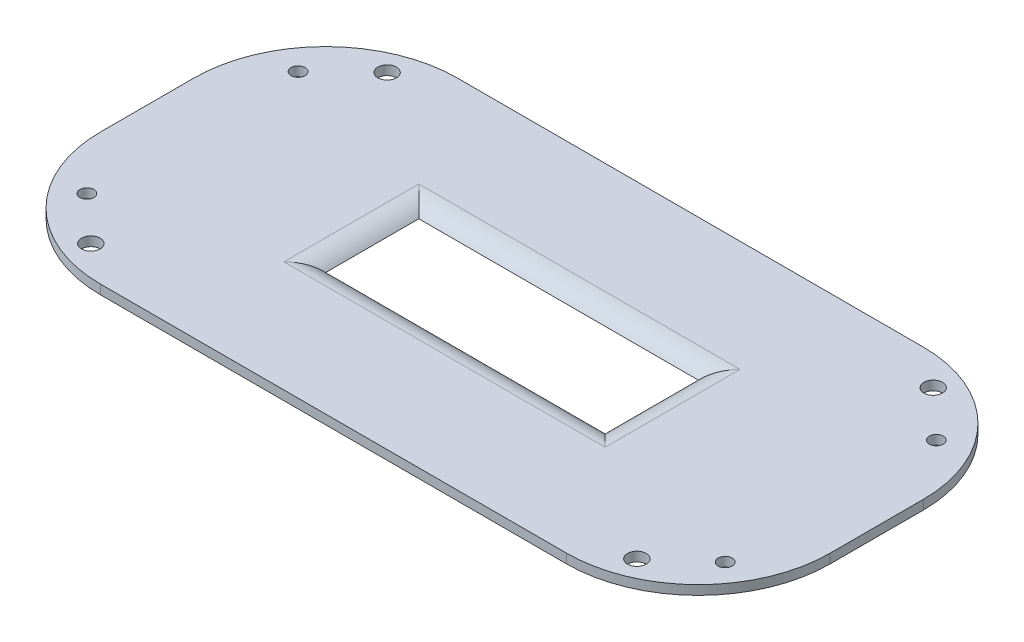
ISO-10303-21;
HEADER;
FILE_DESCRIPTION(('STEP AP214'),'2;1');
FILE_NAME('part.step','',(''),(''),'','','');
FILE_SCHEMA(('AUTOMOTIVE_DESIGN { 1 0 10303 214 1 1 1 1 }'));
ENDSEC;
DATA;
#1=APPLICATION_CONTEXT('core data for automotive mechanical design processes');
#2=APPLICATION_PROTOCOL_DEFINITION('international standard','automotive_design',2000,#1);
#3=PRODUCT_CONTEXT('',#1,'mechanical');
#4=PRODUCT('Part','Part','',(#3));
#5=PRODUCT_RELATED_PRODUCT_CATEGORY('part','',(#4));
#6=PRODUCT_DEFINITION_FORMATION('','',#4);
#7=PRODUCT_DEFINITION_CONTEXT('part definition',#1,'design');
#8=PRODUCT_DEFINITION('design','',#6,#7);
#9=PRODUCT_DEFINITION_SHAPE('','',#8);
#10=(LENGTH_UNIT() NAMED_UNIT(*) SI_UNIT(.MILLI.,.METRE.));
#11=(NAMED_UNIT(*) PLANE_ANGLE_UNIT() SI_UNIT($,.RADIAN.));
#12=(NAMED_UNIT(*) SI_UNIT($,.STERADIAN.) SOLID_ANGLE_UNIT());
#13=UNCERTAINTY_MEASURE_WITH_UNIT(LENGTH_MEASURE(1.E-05),#10,'distance_accuracy_value','');
#14=(GEOMETRIC_REPRESENTATION_CONTEXT(3) GLOBAL_UNCERTAINTY_ASSIGNED_CONTEXT((#13)) GLOBAL_UNIT_ASSIGNED_CONTEXT((#10,
#11,#12)) REPRESENTATION_CONTEXT('',''));
#15=CARTESIAN_POINT('',(0.,0.,0.));
#16=DIRECTION('',(0.,0.,1.));
#17=DIRECTION('',(1.,0.,0.));
#18=AXIS2_PLACEMENT_3D('',#15,#16,#17);
#19=CARTESIAN_POINT('',(0.,-33.,0.));
#20=DIRECTION('',(0.,-1.,0.));
#21=DIRECTION('',(0.,0.,-1.));
#22=AXIS2_PLACEMENT_3D('',#19,#20,#21);
#23=PLANE('',#22);
#24=DIRECTION('',(0.,0.,1.));
#25=VECTOR('',#24,1.);
#26=CARTESIAN_POINT('',(-34.4721359549996,-33.,0.));
#27=LINE('',#26,#25);
#28=CARTESIAN_POINT('',(-34.4721359549996,-33.,14.4721359549996));
#29=VERTEX_POINT('',#28);
#30=CARTESIAN_POINT('',(-34.4721359549996,-33.,-14.4721359549996));
#31=VERTEX_POINT('',#30);
#32=EDGE_CURVE('E65',#29,#31,#27,.F.);
#33=ORIENTED_EDGE('',*,*,#32,.T.);
#34=DIRECTION('',(-1.,0.,0.));
#35=VECTOR('',#34,1.);
#36=CARTESIAN_POINT('',(0.,-33.,-14.4721359549996));
#37=LINE('',#36,#35);
#38=CARTESIAN_POINT('',(34.4721359549996,-33.,-14.4721359549996));
#39=VERTEX_POINT('',#38);
#40=EDGE_CURVE('E11',#31,#39,#37,.F.);
#41=ORIENTED_EDGE('',*,*,#40,.T.);
#42=DIRECTION('',(0.,0.,-1.));
#43=VECTOR('',#42,1.);
#44=CARTESIAN_POINT('',(34.4721359549996,-33.,0.));
#45=LINE('',#44,#43);
#46=CARTESIAN_POINT('',(34.4721359549996,-33.,14.4721359549996));
#47=VERTEX_POINT('',#46);
#48=EDGE_CURVE('E205',#39,#47,#45,.F.);
#49=ORIENTED_EDGE('',*,*,#48,.T.);
#50=DIRECTION('',(1.,0.,0.));
#51=VECTOR('',#50,1.);
#52=CARTESIAN_POINT('',(0.,-33.,14.4721359549996));
#53=LINE('',#52,#51);
#54=EDGE_CURVE('E76',#47,#29,#53,.F.);
#55=ORIENTED_EDGE('',*,*,#54,.T.);
#56=EDGE_LOOP('',(#33,#41,#49,#55));
#57=FACE_BOUND('',#56,.T.);
#58=CARTESIAN_POINT('',(-68.3210170546388,-33.,22.9274377046451));
#59=DIRECTION('',(0.,1.,0.));
#60=DIRECTION('',(0.,0.,-1.));
#61=AXIS2_PLACEMENT_3D('',#58,#59,#60);
#62=CIRCLE('',#61,1.5);
#63=CARTESIAN_POINT('',(-68.3210170546388,-33.,21.4274377046451));
#64=VERTEX_POINT('',#63);
#65=EDGE_CURVE('E244',#64,#64,#62,.T.);
#66=ORIENTED_EDGE('',*,*,#65,.F.);
#67=EDGE_LOOP('',(#66));
#68=FACE_BOUND('',#67,.T.);
#69=CARTESIAN_POINT('',(68.6789829453612,-33.,22.9274377046451));
#70=DIRECTION('',(0.,1.,0.));
#71=DIRECTION('',(0.,0.,1.));
#72=AXIS2_PLACEMENT_3D('',#69,#70,#71);
#73=CIRCLE('',#72,1.5);
#74=CARTESIAN_POINT('',(68.6789829453612,-33.,24.4274377046451));
#75=VERTEX_POINT('',#74);
#76=EDGE_CURVE('E247',#75,#75,#73,.T.);
#77=ORIENTED_EDGE('',*,*,#76,.F.);
#78=EDGE_LOOP('',(#77));
#79=FACE_BOUND('',#78,.T.);
#80=CARTESIAN_POINT('',(68.6789829453612,-33.,-22.3904888685615));
#81=DIRECTION('',(0.,1.,0.));
#82=DIRECTION('',(0.,0.,-1.));
#83=AXIS2_PLACEMENT_3D('',#80,#81,#82);
#84=CIRCLE('',#83,1.5);
#85=CARTESIAN_POINT('',(68.6789829453612,-33.,-23.8904888685615));
#86=VERTEX_POINT('',#85);
#87=EDGE_CURVE('E253',#86,#86,#84,.T.);
#88=ORIENTED_EDGE('',*,*,#87,.F.);
#89=EDGE_LOOP('',(#88));
#90=FACE_BOUND('',#89,.T.);
#91=CARTESIAN_POINT('',(-68.3210170546388,-33.,-22.3904888685615));
#92=DIRECTION('',(0.,1.,0.));
#93=DIRECTION('',(0.,0.,1.));
#94=AXIS2_PLACEMENT_3D('',#91,#92,#93);
#95=CIRCLE('',#94,1.5);
#96=CARTESIAN_POINT('',(-68.3210170546388,-33.,-20.8904888685615));
#97=VERTEX_POINT('',#96);
#98=EDGE_CURVE('E257',#97,#97,#95,.T.);
#99=ORIENTED_EDGE('',*,*,#98,.F.);
#100=EDGE_LOOP('',(#99));
#101=FACE_BOUND('',#100,.T.);
#102=CARTESIAN_POINT('',(-58.6,-33.,-31.8));
#103=DIRECTION('',(0.,-1.,0.));
#104=DIRECTION('',(1.,0.,0.));
#105=AXIS2_PLACEMENT_3D('',#102,#103,#104);
#106=CIRCLE('',#105,2.);
#107=CARTESIAN_POINT('',(-60.6,-33.,-31.8));
#108=VERTEX_POINT('',#107);
#109=EDGE_CURVE('E305',#108,#108,#106,.T.);
#110=ORIENTED_EDGE('',*,*,#109,.T.);
#111=EDGE_LOOP('',(#110));
#112=FACE_BOUND('',#111,.T.);
#113=CARTESIAN_POINT('',(-58.6,-33.,31.8));
#114=DIRECTION('',(0.,-1.,0.));
#115=DIRECTION('',(1.,0.,0.));
#116=AXIS2_PLACEMENT_3D('',#113,#114,#115);
#117=CIRCLE('',#116,2.);
#118=CARTESIAN_POINT('',(-60.6,-33.,31.8));
#119=VERTEX_POINT('',#118);
#120=EDGE_CURVE('E267',#119,#119,#117,.T.);
#121=ORIENTED_EDGE('',*,*,#120,.T.);
#122=EDGE_LOOP('',(#121));
#123=FACE_BOUND('',#122,.T.);
#124=CARTESIAN_POINT('',(58.6,-33.,-31.8));
#125=DIRECTION('',(0.,-1.,0.));
#126=DIRECTION('',(1.,0.,0.));
#127=AXIS2_PLACEMENT_3D('',#124,#125,#126);
#128=CIRCLE('',#127,2.);
#129=CARTESIAN_POINT('',(56.6,-33.,-31.8));
#130=VERTEX_POINT('',#129);
#131=EDGE_CURVE('E298',#130,#130,#128,.T.);
#132=ORIENTED_EDGE('',*,*,#131,.T.);
#133=EDGE_LOOP('',(#132));
#134=FACE_BOUND('',#133,.T.);
#135=CARTESIAN_POINT('',(58.6,-33.,31.8));
#136=DIRECTION('',(0.,-1.,0.));
#137=DIRECTION('',(1.,0.,0.));
#138=AXIS2_PLACEMENT_3D('',#135,#136,#137);
#139=CIRCLE('',#138,2.);
#140=CARTESIAN_POINT('',(56.6,-33.,31.8));
#141=VERTEX_POINT('',#140);
#142=EDGE_CURVE('E262',#141,#141,#139,.T.);
#143=ORIENTED_EDGE('',*,*,#142,.T.);
#144=EDGE_LOOP('',(#143));
#145=FACE_BOUND('',#144,.T.);
#146=CARTESIAN_POINT('',(50.,-33.,10.));
#147=DIRECTION('',(0.,1.,0.));
#148=DIRECTION('',(1.,0.,0.));
#149=AXIS2_PLACEMENT_3D('',#146,#147,#148);
#150=CIRCLE('',#149,28.3);
#151=CARTESIAN_POINT('',(50.,-33.,38.3));
#152=VERTEX_POINT('',#151);
#153=CARTESIAN_POINT('',(78.3,-33.,10.));
#154=VERTEX_POINT('',#153);
#155=EDGE_CURVE('E220',#152,#154,#150,.T.);
#156=ORIENTED_EDGE('',*,*,#155,.T.);
#157=DIRECTION('',(0.,0.,-1.));
#158=VECTOR('',#157,1.);
#159=CARTESIAN_POINT('',(78.3,-33.,10.));
#160=LINE('',#159,#158);
#161=CARTESIAN_POINT('',(78.3,-33.,-10.));
#162=VERTEX_POINT('',#161);
#163=EDGE_CURVE('E378',#154,#162,#160,.T.);
#164=ORIENTED_EDGE('',*,*,#163,.T.);
#165=CARTESIAN_POINT('',(50.,-33.,-10.));
#166=DIRECTION('',(0.,1.,0.));
#167=DIRECTION('',(0.,0.,-1.));
#168=AXIS2_PLACEMENT_3D('',#165,#166,#167);
#169=CIRCLE('',#168,28.3);
#170=CARTESIAN_POINT('',(50.,-33.,-38.3));
#171=VERTEX_POINT('',#170);
#172=EDGE_CURVE('E368',#162,#171,#169,.T.);
#173=ORIENTED_EDGE('',*,*,#172,.T.);
#174=DIRECTION('',(-1.,0.,0.));
#175=VECTOR('',#174,1.);
#176=CARTESIAN_POINT('',(50.,-33.,-38.3));
#177=LINE('',#176,#175);
#178=CARTESIAN_POINT('',(-50.,-33.,-38.3));
#179=VERTEX_POINT('',#178);
#180=EDGE_CURVE('E357',#171,#179,#177,.T.);
#181=ORIENTED_EDGE('',*,*,#180,.T.);
#182=CARTESIAN_POINT('',(-50.,-33.,-10.));
#183=DIRECTION('',(0.,1.,0.));
#184=DIRECTION('',(-1.,0.,0.));
#185=AXIS2_PLACEMENT_3D('',#182,#183,#184);
#186=CIRCLE('',#185,28.3);
#187=CARTESIAN_POINT('',(-78.3,-33.,-10.));
#188=VERTEX_POINT('',#187);
#189=EDGE_CURVE('E291',#179,#188,#186,.T.);
#190=ORIENTED_EDGE('',*,*,#189,.T.);
#191=DIRECTION('',(0.,0.,1.));
#192=VECTOR('',#191,1.);
#193=CARTESIAN_POINT('',(-78.3,-33.,-10.));
#194=LINE('',#193,#192);
#195=CARTESIAN_POINT('',(-78.3,-33.,10.));
#196=VERTEX_POINT('',#195);
#197=EDGE_CURVE('E319',#188,#196,#194,.T.);
#198=ORIENTED_EDGE('',*,*,#197,.T.);
#199=CARTESIAN_POINT('',(-50.,-33.,10.));
#200=DIRECTION('',(0.,1.,0.));
#201=DIRECTION('',(0.,0.,1.));
#202=AXIS2_PLACEMENT_3D('',#199,#200,#201);
#203=CIRCLE('',#202,28.3);
#204=CARTESIAN_POINT('',(-50.,-33.,38.3));
#205=VERTEX_POINT('',#204);
#206=EDGE_CURVE('E336',#196,#205,#203,.T.);
#207=ORIENTED_EDGE('',*,*,#206,.T.);
#208=DIRECTION('',(1.,0.,0.));
#209=VECTOR('',#208,1.);
#210=CARTESIAN_POINT('',(-50.,-33.,38.3));
#211=LINE('',#210,#209);
#212=EDGE_CURVE('E285',#205,#152,#211,.T.);
#213=ORIENTED_EDGE('',*,*,#212,.T.);
#214=EDGE_LOOP('',(#156,#164,#173,#181,#190,#198,#207,#213));
#215=FACE_BOUND('',#214,.T.);
#216=ADVANCED_FACE('F55',(#57,#68,#79,#90,#101,#112,#123,#134,#145,#215),#23,.F.);
#217=CARTESIAN_POINT('',(0.,-35.,0.));
#218=DIRECTION('',(0.,-1.,0.));
#219=DIRECTION('',(0.,0.,-1.));
#220=AXIS2_PLACEMENT_3D('',#217,#218,#219);
#221=PLANE('',#220);
#222=DIRECTION('',(0.,0.,1.));
#223=VECTOR('',#222,1.);
#224=CARTESIAN_POINT('',(30.,-35.,0.));
#225=LINE('',#224,#223);
#226=CARTESIAN_POINT('',(30.,-35.,-10.));
#227=VERTEX_POINT('',#226);
#228=CARTESIAN_POINT('',(30.,-35.,10.));
#229=VERTEX_POINT('',#228);
#230=EDGE_CURVE('E193',#227,#229,#225,.T.);
#231=ORIENTED_EDGE('',*,*,#230,.F.);
#232=DIRECTION('',(1.,0.,0.));
#233=VECTOR('',#232,1.);
#234=CARTESIAN_POINT('',(0.,-35.,-10.));
#235=LINE('',#234,#233);
#236=CARTESIAN_POINT('',(-30.,-35.,-10.));
#237=VERTEX_POINT('',#236);
#238=EDGE_CURVE('E198',#237,#227,#235,.T.);
#239=ORIENTED_EDGE('',*,*,#238,.F.);
#240=DIRECTION('',(0.,0.,-1.));
#241=VECTOR('',#240,1.);
#242=CARTESIAN_POINT('',(-30.,-35.,0.));
#243=LINE('',#242,#241);
#244=CARTESIAN_POINT('',(-30.,-35.,10.));
#245=VERTEX_POINT('',#244);
#246=EDGE_CURVE('E219',#245,#237,#243,.T.);
#247=ORIENTED_EDGE('',*,*,#246,.F.);
#248=DIRECTION('',(-1.,0.,0.));
#249=VECTOR('',#248,1.);
#250=CARTESIAN_POINT('',(0.,-35.,10.));
#251=LINE('',#250,#249);
#252=EDGE_CURVE('E200',#229,#245,#251,.T.);
#253=ORIENTED_EDGE('',*,*,#252,.F.);
#254=EDGE_LOOP('',(#231,#239,#247,#253));
#255=FACE_BOUND('',#254,.T.);
#256=CARTESIAN_POINT('',(-68.3210170546388,-35.,22.9274377046451));
#257=DIRECTION('',(0.,-1.,0.));
#258=DIRECTION('',(0.,0.,-1.));
#259=AXIS2_PLACEMENT_3D('',#256,#257,#258);
#260=CIRCLE('',#259,1.5);
#261=CARTESIAN_POINT('',(-68.3210170546388,-35.,21.4274377046451));
#262=VERTEX_POINT('',#261);
#263=EDGE_CURVE('E228',#262,#262,#260,.T.);
#264=ORIENTED_EDGE('',*,*,#263,.F.);
#265=EDGE_LOOP('',(#264));
#266=FACE_BOUND('',#265,.T.);
#267=CARTESIAN_POINT('',(68.6789829453612,-35.,22.9274377046451));
#268=DIRECTION('',(0.,-1.,0.));
#269=DIRECTION('',(0.,0.,-1.));
#270=AXIS2_PLACEMENT_3D('',#267,#268,#269);
#271=CIRCLE('',#270,1.5);
#272=CARTESIAN_POINT('',(68.6789829453612,-35.,21.4274377046451));
#273=VERTEX_POINT('',#272);
#274=EDGE_CURVE('E393',#273,#273,#271,.T.);
#275=ORIENTED_EDGE('',*,*,#274,.F.);
#276=EDGE_LOOP('',(#275));
#277=FACE_BOUND('',#276,.T.);
#278=CARTESIAN_POINT('',(68.6789829453612,-35.,-22.3904888685615));
#279=DIRECTION('',(0.,-1.,0.));
#280=DIRECTION('',(0.,0.,-1.));
#281=AXIS2_PLACEMENT_3D('',#278,#279,#280);
#282=CIRCLE('',#281,1.5);
#283=CARTESIAN_POINT('',(68.6789829453612,-35.,-23.8904888685615));
#284=VERTEX_POINT('',#283);
#285=EDGE_CURVE('E390',#284,#284,#282,.T.);
#286=ORIENTED_EDGE('',*,*,#285,.F.);
#287=EDGE_LOOP('',(#286));
#288=FACE_BOUND('',#287,.T.);
#289=CARTESIAN_POINT('',(-68.3210170546388,-35.,-22.3904888685615));
#290=DIRECTION('',(0.,-1.,0.));
#291=DIRECTION('',(0.,0.,-1.));
#292=AXIS2_PLACEMENT_3D('',#289,#290,#291);
#293=CIRCLE('',#292,1.5);
#294=CARTESIAN_POINT('',(-68.3210170546388,-35.,-23.8904888685615));
#295=VERTEX_POINT('',#294);
#296=EDGE_CURVE('E261',#295,#295,#293,.T.);
#297=ORIENTED_EDGE('',*,*,#296,.F.);
#298=EDGE_LOOP('',(#297));
#299=FACE_BOUND('',#298,.T.);
#300=CARTESIAN_POINT('',(-58.6,-35.,-31.8));
#301=DIRECTION('',(0.,1.,0.));
#302=DIRECTION('',(1.,0.,0.));
#303=AXIS2_PLACEMENT_3D('',#300,#301,#302);
#304=CIRCLE('',#303,2.);
#305=CARTESIAN_POINT('',(-60.6,-35.,-31.8));
#306=VERTEX_POINT('',#305);
#307=EDGE_CURVE('E327',#306,#306,#304,.T.);
#308=ORIENTED_EDGE('',*,*,#307,.T.);
#309=EDGE_LOOP('',(#308));
#310=FACE_BOUND('',#309,.T.);
#311=CARTESIAN_POINT('',(-58.6,-35.,31.8));
#312=DIRECTION('',(0.,1.,0.));
#313=DIRECTION('',(1.,0.,0.));
#314=AXIS2_PLACEMENT_3D('',#311,#312,#313);
#315=CIRCLE('',#314,2.);
#316=CARTESIAN_POINT('',(-60.6,-35.,31.8));
#317=VERTEX_POINT('',#316);
#318=EDGE_CURVE('E310',#317,#317,#315,.T.);
#319=ORIENTED_EDGE('',*,*,#318,.T.);
#320=EDGE_LOOP('',(#319));
#321=FACE_BOUND('',#320,.T.);
#322=CARTESIAN_POINT('',(58.6,-35.,-31.8));
#323=DIRECTION('',(0.,1.,0.));
#324=DIRECTION('',(1.,0.,0.));
#325=AXIS2_PLACEMENT_3D('',#322,#323,#324);
#326=CIRCLE('',#325,2.);
#327=CARTESIAN_POINT('',(56.6,-35.,-31.8));
#328=VERTEX_POINT('',#327);
#329=EDGE_CURVE('E272',#328,#328,#326,.T.);
#330=ORIENTED_EDGE('',*,*,#329,.T.);
#331=EDGE_LOOP('',(#330));
#332=FACE_BOUND('',#331,.T.);
#333=CARTESIAN_POINT('',(58.6,-35.,31.8));
#334=DIRECTION('',(0.,1.,0.));
#335=DIRECTION('',(1.,0.,0.));
#336=AXIS2_PLACEMENT_3D('',#333,#334,#335);
#337=CIRCLE('',#336,2.);
#338=CARTESIAN_POINT('',(56.6,-35.,31.8));
#339=VERTEX_POINT('',#338);
#340=EDGE_CURVE('E276',#339,#339,#337,.T.);
#341=ORIENTED_EDGE('',*,*,#340,.T.);
#342=EDGE_LOOP('',(#341));
#343=FACE_BOUND('',#342,.T.);
#344=CARTESIAN_POINT('',(50.,-35.,10.));
#345=DIRECTION('',(0.,-1.,0.));
#346=DIRECTION('',(1.,0.,0.));
#347=AXIS2_PLACEMENT_3D('',#344,#345,#346);
#348=CIRCLE('',#347,28.3);
#349=CARTESIAN_POINT('',(78.3,-35.,10.));
#350=VERTEX_POINT('',#349);
#351=CARTESIAN_POINT('',(50.,-35.,38.3));
#352=VERTEX_POINT('',#351);
#353=EDGE_CURVE('E225',#350,#352,#348,.T.);
#354=ORIENTED_EDGE('',*,*,#353,.T.);
#355=DIRECTION('',(1.,0.,0.));
#356=VECTOR('',#355,1.);
#357=CARTESIAN_POINT('',(-50.,-35.,38.3));
#358=LINE('',#357,#356);
#359=CARTESIAN_POINT('',(-50.,-35.,38.3));
#360=VERTEX_POINT('',#359);
#361=EDGE_CURVE('E290',#360,#352,#358,.T.);
#362=ORIENTED_EDGE('',*,*,#361,.F.);
#363=CARTESIAN_POINT('',(-50.,-35.,10.));
#364=DIRECTION('',(0.,-1.,0.));
#365=DIRECTION('',(0.,0.,1.));
#366=AXIS2_PLACEMENT_3D('',#363,#364,#365);
#367=CIRCLE('',#366,28.3);
#368=CARTESIAN_POINT('',(-78.3,-35.,10.));
#369=VERTEX_POINT('',#368);
#370=EDGE_CURVE('E284',#360,#369,#367,.T.);
#371=ORIENTED_EDGE('',*,*,#370,.T.);
#372=DIRECTION('',(0.,0.,1.));
#373=VECTOR('',#372,1.);
#374=CARTESIAN_POINT('',(-78.3,-35.,-10.));
#375=LINE('',#374,#373);
#376=CARTESIAN_POINT('',(-78.3,-35.,-10.));
#377=VERTEX_POINT('',#376);
#378=EDGE_CURVE('E316',#377,#369,#375,.T.);
#379=ORIENTED_EDGE('',*,*,#378,.F.);
#380=CARTESIAN_POINT('',(-50.,-35.,-10.));
#381=DIRECTION('',(0.,-1.,0.));
#382=DIRECTION('',(-1.,0.,0.));
#383=AXIS2_PLACEMENT_3D('',#380,#381,#382);
#384=CIRCLE('',#383,28.3);
#385=CARTESIAN_POINT('',(-50.,-35.,-38.3));
#386=VERTEX_POINT('',#385);
#387=EDGE_CURVE('E295',#377,#386,#384,.T.);
#388=ORIENTED_EDGE('',*,*,#387,.T.);
#389=DIRECTION('',(-1.,0.,0.));
#390=VECTOR('',#389,1.);
#391=CARTESIAN_POINT('',(50.,-35.,-38.3));
#392=LINE('',#391,#390);
#393=CARTESIAN_POINT('',(50.,-35.,-38.3));
#394=VERTEX_POINT('',#393);
#395=EDGE_CURVE('E354',#394,#386,#392,.T.);
#396=ORIENTED_EDGE('',*,*,#395,.F.);
#397=CARTESIAN_POINT('',(50.,-35.,-10.));
#398=DIRECTION('',(0.,-1.,0.));
#399=DIRECTION('',(0.,0.,-1.));
#400=AXIS2_PLACEMENT_3D('',#397,#398,#399);
#401=CIRCLE('',#400,28.3);
#402=CARTESIAN_POINT('',(78.3,-35.,-10.));
#403=VERTEX_POINT('',#402);
#404=EDGE_CURVE('E364',#394,#403,#401,.T.);
#405=ORIENTED_EDGE('',*,*,#404,.T.);
#406=DIRECTION('',(0.,0.,-1.));
#407=VECTOR('',#406,1.);
#408=CARTESIAN_POINT('',(78.3,-35.,10.));
#409=LINE('',#408,#407);
#410=EDGE_CURVE('E375',#350,#403,#409,.T.);
#411=ORIENTED_EDGE('',*,*,#410,.F.);
#412=EDGE_LOOP('',(#354,#362,#371,#379,#388,#396,#405,#411));
#413=FACE_BOUND('',#412,.T.);
#414=ADVANCED_FACE('F195',(#255,#266,#277,#288,#299,#310,#321,#332,#343,#413),#221,.T.);
#415=CARTESIAN_POINT('',(50.,-35.,10.));
#416=DIRECTION('',(0.,1.,0.));
#417=DIRECTION('',(1.,0.,0.));
#418=AXIS2_PLACEMENT_3D('',#415,#416,#417);
#419=CYLINDRICAL_SURFACE('',#418,28.3);
#420=ORIENTED_EDGE('',*,*,#353,.F.);
#421=DIRECTION('',(0.,1.,0.));
#422=VECTOR('',#421,1.);
#423=CARTESIAN_POINT('',(78.3,-35.,10.));
#424=LINE('',#423,#422);
#425=EDGE_CURVE('E381',#350,#154,#424,.T.);
#426=ORIENTED_EDGE('',*,*,#425,.T.);
#427=ORIENTED_EDGE('',*,*,#155,.F.);
#428=DIRECTION('',(0.,1.,0.));
#429=VECTOR('',#428,1.);
#430=CARTESIAN_POINT('',(50.,-35.,38.3));
#431=LINE('',#430,#429);
#432=EDGE_CURVE('E286',#352,#152,#431,.T.);
#433=ORIENTED_EDGE('',*,*,#432,.F.);
#434=EDGE_LOOP('',(#420,#426,#427,#433));
#435=FACE_BOUND('',#434,.T.);
#436=ADVANCED_FACE('F405',(#435),#419,.T.);
#437=CARTESIAN_POINT('',(78.3,-35.,10.));
#438=DIRECTION('',(1.,0.,0.));
#439=DIRECTION('',(0.,1.,0.));
#440=AXIS2_PLACEMENT_3D('',#437,#438,#439);
#441=PLANE('',#440);
#442=ORIENTED_EDGE('',*,*,#410,.T.);
#443=DIRECTION('',(0.,1.,0.));
#444=VECTOR('',#443,1.);
#445=CARTESIAN_POINT('',(78.3,-35.,-10.));
#446=LINE('',#445,#444);
#447=EDGE_CURVE('E371',#403,#162,#446,.T.);
#448=ORIENTED_EDGE('',*,*,#447,.T.);
#449=ORIENTED_EDGE('',*,*,#163,.F.);
#450=ORIENTED_EDGE('',*,*,#425,.F.);
#451=EDGE_LOOP('',(#442,#448,#449,#450));
#452=FACE_BOUND('',#451,.T.);
#453=ADVANCED_FACE('F453',(#452),#441,.T.);
#454=CARTESIAN_POINT('',(50.,-35.,-10.));
#455=DIRECTION('',(0.,1.,0.));
#456=DIRECTION('',(0.,0.,-1.));
#457=AXIS2_PLACEMENT_3D('',#454,#455,#456);
#458=CYLINDRICAL_SURFACE('',#457,28.3);
#459=ORIENTED_EDGE('',*,*,#404,.F.);
#460=DIRECTION('',(0.,1.,0.));
#461=VECTOR('',#460,1.);
#462=CARTESIAN_POINT('',(50.,-35.,-38.3));
#463=LINE('',#462,#461);
#464=EDGE_CURVE('E360',#394,#171,#463,.T.);
#465=ORIENTED_EDGE('',*,*,#464,.T.);
#466=ORIENTED_EDGE('',*,*,#172,.F.);
#467=ORIENTED_EDGE('',*,*,#447,.F.);
#468=EDGE_LOOP('',(#459,#465,#466,#467));
#469=FACE_BOUND('',#468,.T.);
#470=ADVANCED_FACE('F449',(#469),#458,.T.);
#471=CARTESIAN_POINT('',(50.,-35.,-38.3));
#472=DIRECTION('',(0.,0.,-1.));
#473=DIRECTION('',(0.,-1.,0.));
#474=AXIS2_PLACEMENT_3D('',#471,#472,#473);
#475=PLANE('',#474);
#476=ORIENTED_EDGE('',*,*,#395,.T.);
#477=DIRECTION('',(0.,1.,0.));
#478=VECTOR('',#477,1.);
#479=CARTESIAN_POINT('',(-50.,-35.,-38.3));
#480=LINE('',#479,#478);
#481=EDGE_CURVE('E294',#386,#179,#480,.T.);
#482=ORIENTED_EDGE('',*,*,#481,.T.);
#483=ORIENTED_EDGE('',*,*,#180,.F.);
#484=ORIENTED_EDGE('',*,*,#464,.F.);
#485=EDGE_LOOP('',(#476,#482,#483,#484));
#486=FACE_BOUND('',#485,.T.);
#487=ADVANCED_FACE('F445',(#486),#475,.T.);
#488=CARTESIAN_POINT('',(-50.,-35.,-10.));
#489=DIRECTION('',(0.,1.,0.));
#490=DIRECTION('',(-1.,0.,0.));
#491=AXIS2_PLACEMENT_3D('',#488,#489,#490);
#492=CYLINDRICAL_SURFACE('',#491,28.3);
#493=ORIENTED_EDGE('',*,*,#387,.F.);
#494=DIRECTION('',(0.,1.,0.));
#495=VECTOR('',#494,1.);
#496=CARTESIAN_POINT('',(-78.3,-35.,-10.));
#497=LINE('',#496,#495);
#498=EDGE_CURVE('E344',#377,#188,#497,.T.);
#499=ORIENTED_EDGE('',*,*,#498,.T.);
#500=ORIENTED_EDGE('',*,*,#189,.F.);
#501=ORIENTED_EDGE('',*,*,#481,.F.);
#502=EDGE_LOOP('',(#493,#499,#500,#501));
#503=FACE_BOUND('',#502,.T.);
#504=ADVANCED_FACE('F441',(#503),#492,.T.);
#505=CARTESIAN_POINT('',(-78.3,-35.,-10.));
#506=DIRECTION('',(-1.,0.,0.));
#507=DIRECTION('',(0.,0.,1.));
#508=AXIS2_PLACEMENT_3D('',#505,#506,#507);
#509=PLANE('',#508);
#510=ORIENTED_EDGE('',*,*,#378,.T.);
#511=DIRECTION('',(0.,1.,0.));
#512=VECTOR('',#511,1.);
#513=CARTESIAN_POINT('',(-78.3,-35.,10.));
#514=LINE('',#513,#512);
#515=EDGE_CURVE('E320',#369,#196,#514,.T.);
#516=ORIENTED_EDGE('',*,*,#515,.T.);
#517=ORIENTED_EDGE('',*,*,#197,.F.);
#518=ORIENTED_EDGE('',*,*,#498,.F.);
#519=EDGE_LOOP('',(#510,#516,#517,#518));
#520=FACE_BOUND('',#519,.T.);
#521=ADVANCED_FACE('F437',(#520),#509,.T.);
#522=CARTESIAN_POINT('',(-50.,-35.,10.));
#523=DIRECTION('',(0.,1.,0.));
#524=DIRECTION('',(0.,0.,1.));
#525=AXIS2_PLACEMENT_3D('',#522,#523,#524);
#526=CYLINDRICAL_SURFACE('',#525,28.3);
#527=ORIENTED_EDGE('',*,*,#370,.F.);
#528=DIRECTION('',(0.,1.,0.));
#529=VECTOR('',#528,1.);
#530=CARTESIAN_POINT('',(-50.,-35.,38.3));
#531=LINE('',#530,#529);
#532=EDGE_CURVE('E280',#360,#205,#531,.T.);
#533=ORIENTED_EDGE('',*,*,#532,.T.);
#534=ORIENTED_EDGE('',*,*,#206,.F.);
#535=ORIENTED_EDGE('',*,*,#515,.F.);
#536=EDGE_LOOP('',(#527,#533,#534,#535));
#537=FACE_BOUND('',#536,.T.);
#538=ADVANCED_FACE('F431',(#537),#526,.T.);
#539=CARTESIAN_POINT('',(-50.,-35.,38.3));
#540=DIRECTION('',(0.,0.,1.));
#541=DIRECTION('',(1.,0.,0.));
#542=AXIS2_PLACEMENT_3D('',#539,#540,#541);
#543=PLANE('',#542);
#544=ORIENTED_EDGE('',*,*,#361,.T.);
#545=ORIENTED_EDGE('',*,*,#432,.T.);
#546=ORIENTED_EDGE('',*,*,#212,.F.);
#547=ORIENTED_EDGE('',*,*,#532,.F.);
#548=EDGE_LOOP('',(#544,#545,#546,#547));
#549=FACE_BOUND('',#548,.T.);
#550=ADVANCED_FACE('F428',(#549),#543,.T.);
#551=CARTESIAN_POINT('',(-58.6,-33.,-31.8));
#552=DIRECTION('',(0.,-1.,0.));
#553=DIRECTION('',(1.,0.,0.));
#554=AXIS2_PLACEMENT_3D('',#551,#552,#553);
#555=CYLINDRICAL_SURFACE('',#554,2.);
#556=ORIENTED_EDGE('',*,*,#109,.F.);
#557=DIRECTION('',(0.,-1.,0.));
#558=VECTOR('',#557,1.);
#559=CARTESIAN_POINT('',(-60.6,-33.,-31.8));
#560=LINE('',#559,#558);
#561=EDGE_CURVE('E309',#108,#306,#560,.T.);
#562=ORIENTED_EDGE('',*,*,#561,.T.);
#563=ORIENTED_EDGE('',*,*,#307,.F.);
#564=ORIENTED_EDGE('',*,*,#561,.F.);
#565=EDGE_LOOP('',(#556,#562,#563,#564));
#566=FACE_BOUND('',#565,.T.);
#567=ADVANCED_FACE('F500',(#566),#555,.F.);
#568=CARTESIAN_POINT('',(-58.6,-33.,31.8));
#569=DIRECTION('',(0.,-1.,0.));
#570=DIRECTION('',(1.,0.,0.));
#571=AXIS2_PLACEMENT_3D('',#568,#569,#570);
#572=CYLINDRICAL_SURFACE('',#571,2.);
#573=ORIENTED_EDGE('',*,*,#120,.F.);
#574=DIRECTION('',(0.,-1.,0.));
#575=VECTOR('',#574,1.);
#576=CARTESIAN_POINT('',(-60.6,-33.,31.8));
#577=LINE('',#576,#575);
#578=EDGE_CURVE('E271',#119,#317,#577,.T.);
#579=ORIENTED_EDGE('',*,*,#578,.T.);
#580=ORIENTED_EDGE('',*,*,#318,.F.);
#581=ORIENTED_EDGE('',*,*,#578,.F.);
#582=EDGE_LOOP('',(#573,#579,#580,#581));
#583=FACE_BOUND('',#582,.T.);
#584=ADVANCED_FACE('F496',(#583),#572,.F.);
#585=CARTESIAN_POINT('',(58.6,-33.,-31.8));
#586=DIRECTION('',(0.,-1.,0.));
#587=DIRECTION('',(1.,0.,0.));
#588=AXIS2_PLACEMENT_3D('',#585,#586,#587);
#589=CYLINDRICAL_SURFACE('',#588,2.);
#590=ORIENTED_EDGE('',*,*,#131,.F.);
#591=DIRECTION('',(0.,-1.,0.));
#592=VECTOR('',#591,1.);
#593=CARTESIAN_POINT('',(56.6,-33.,-31.8));
#594=LINE('',#593,#592);
#595=EDGE_CURVE('E279',#130,#328,#594,.T.);
#596=ORIENTED_EDGE('',*,*,#595,.T.);
#597=ORIENTED_EDGE('',*,*,#329,.F.);
#598=ORIENTED_EDGE('',*,*,#595,.F.);
#599=EDGE_LOOP('',(#590,#596,#597,#598));
#600=FACE_BOUND('',#599,.T.);
#601=ADVANCED_FACE('F490',(#600),#589,.F.);
#602=CARTESIAN_POINT('',(58.6,-33.,31.8));
#603=DIRECTION('',(0.,-1.,0.));
#604=DIRECTION('',(1.,0.,0.));
#605=AXIS2_PLACEMENT_3D('',#602,#603,#604);
#606=CYLINDRICAL_SURFACE('',#605,2.);
#607=ORIENTED_EDGE('',*,*,#142,.F.);
#608=DIRECTION('',(0.,-1.,0.));
#609=VECTOR('',#608,1.);
#610=CARTESIAN_POINT('',(56.6,-33.,31.8));
#611=LINE('',#610,#609);
#612=EDGE_CURVE('E266',#141,#339,#611,.T.);
#613=ORIENTED_EDGE('',*,*,#612,.T.);
#614=ORIENTED_EDGE('',*,*,#340,.F.);
#615=ORIENTED_EDGE('',*,*,#612,.F.);
#616=EDGE_LOOP('',(#607,#613,#614,#615));
#617=FACE_BOUND('',#616,.T.);
#618=ADVANCED_FACE('F486',(#617),#606,.F.);
#619=CARTESIAN_POINT('',(-68.3210170546388,-43.,-22.3904888685615));
#620=DIRECTION('',(0.,1.,0.));
#621=DIRECTION('',(0.,0.,1.));
#622=AXIS2_PLACEMENT_3D('',#619,#620,#621);
#623=CYLINDRICAL_SURFACE('',#622,1.5);
#624=ORIENTED_EDGE('',*,*,#296,.T.);
#625=EDGE_LOOP('',(#624));
#626=FACE_BOUND('',#625,.T.);
#627=ORIENTED_EDGE('',*,*,#98,.T.);
#628=EDGE_LOOP('',(#627));
#629=FACE_BOUND('',#628,.T.);
#630=ADVANCED_FACE('F483',(#626,#629),#623,.F.);
#631=CARTESIAN_POINT('',(68.6789829453612,-43.,-22.3904888685615));
#632=DIRECTION('',(0.,1.,0.));
#633=DIRECTION('',(0.,0.,1.));
#634=AXIS2_PLACEMENT_3D('',#631,#632,#633);
#635=CYLINDRICAL_SURFACE('',#634,1.5);
#636=ORIENTED_EDGE('',*,*,#285,.T.);
#637=EDGE_LOOP('',(#636));
#638=FACE_BOUND('',#637,.T.);
#639=ORIENTED_EDGE('',*,*,#87,.T.);
#640=EDGE_LOOP('',(#639));
#641=FACE_BOUND('',#640,.T.);
#642=ADVANCED_FACE('F479',(#638,#641),#635,.F.);
#643=CARTESIAN_POINT('',(68.6789829453612,-43.,22.9274377046451));
#644=DIRECTION('',(0.,1.,0.));
#645=DIRECTION('',(0.,0.,1.));
#646=AXIS2_PLACEMENT_3D('',#643,#644,#645);
#647=CYLINDRICAL_SURFACE('',#646,1.5);
#648=ORIENTED_EDGE('',*,*,#274,.T.);
#649=EDGE_LOOP('',(#648));
#650=FACE_BOUND('',#649,.T.);
#651=ORIENTED_EDGE('',*,*,#76,.T.);
#652=EDGE_LOOP('',(#651));
#653=FACE_BOUND('',#652,.T.);
#654=ADVANCED_FACE('F474',(#650,#653),#647,.F.);
#655=CARTESIAN_POINT('',(-68.3210170546388,-43.,22.9274377046451));
#656=DIRECTION('',(0.,1.,0.));
#657=DIRECTION('',(0.,0.,1.));
#658=AXIS2_PLACEMENT_3D('',#655,#656,#657);
#659=CYLINDRICAL_SURFACE('',#658,1.5);
#660=ORIENTED_EDGE('',*,*,#263,.T.);
#661=EDGE_LOOP('',(#660));
#662=FACE_BOUND('',#661,.T.);
#663=ORIENTED_EDGE('',*,*,#65,.T.);
#664=EDGE_LOOP('',(#663));
#665=FACE_BOUND('',#664,.T.);
#666=ADVANCED_FACE('F402',(#662,#665),#659,.F.);
#667=CARTESIAN_POINT('',(-30.,-39.,14.4721359549996));
#668=DIRECTION('',(1.,0.,0.));
#669=DIRECTION('',(0.,0.,-1.));
#670=AXIS2_PLACEMENT_3D('',#667,#668,#669);
#671=CYLINDRICAL_SURFACE('',#670,6.);
#672=CARTESIAN_POINT('',(-34.4721359549996,-39.,14.4721359549996));
#673=DIRECTION('',(0.707106781186547,0.,0.707106781186547));
#674=DIRECTION('',(-0.707106781186547,0.,0.707106781186547));
#675=AXIS2_PLACEMENT_3D('',#672,#673,#674);
#676=ELLIPSE('',#675,8.48528137423857,6.);
#677=EDGE_CURVE('E212',#29,#245,#676,.F.);
#678=ORIENTED_EDGE('',*,*,#677,.F.);
#679=ORIENTED_EDGE('',*,*,#54,.F.);
#680=CARTESIAN_POINT('',(34.4721359549996,-39.,14.4721359549996));
#681=DIRECTION('',(0.707106781186547,0.,-0.707106781186547));
#682=DIRECTION('',(0.707106781186547,0.,0.707106781186547));
#683=AXIS2_PLACEMENT_3D('',#680,#681,#682);
#684=ELLIPSE('',#683,8.48528137423857,6.);
#685=EDGE_CURVE('E59',#229,#47,#684,.T.);
#686=ORIENTED_EDGE('',*,*,#685,.F.);
#687=ORIENTED_EDGE('',*,*,#252,.T.);
#688=EDGE_LOOP('',(#678,#679,#686,#687));
#689=FACE_BOUND('',#688,.T.);
#690=ADVANCED_FACE('F57',(#689),#671,.T.);
#691=CARTESIAN_POINT('',(34.4721359549996,-39.,10.));
#692=DIRECTION('',(0.,0.,-1.));
#693=DIRECTION('',(-1.,0.,0.));
#694=AXIS2_PLACEMENT_3D('',#691,#692,#693);
#695=CYLINDRICAL_SURFACE('',#694,6.);
#696=ORIENTED_EDGE('',*,*,#685,.T.);
#697=ORIENTED_EDGE('',*,*,#48,.F.);
#698=CARTESIAN_POINT('',(34.4721359549996,-39.,-14.4721359549996));
#699=DIRECTION('',(-0.707106781186547,0.,-0.707106781186547));
#700=DIRECTION('',(-0.707106781186547,0.,0.707106781186547));
#701=AXIS2_PLACEMENT_3D('',#698,#699,#700);
#702=ELLIPSE('',#701,8.48528137423857,6.);
#703=EDGE_CURVE('E208',#227,#39,#702,.T.);
#704=ORIENTED_EDGE('',*,*,#703,.F.);
#705=ORIENTED_EDGE('',*,*,#230,.T.);
#706=EDGE_LOOP('',(#696,#697,#704,#705));
#707=FACE_BOUND('',#706,.T.);
#708=ADVANCED_FACE('F209',(#707),#695,.T.);
#709=CARTESIAN_POINT('',(-34.4721359549996,-39.,10.));
#710=DIRECTION('',(0.,0.,1.));
#711=DIRECTION('',(1.,0.,0.));
#712=AXIS2_PLACEMENT_3D('',#709,#710,#711);
#713=CYLINDRICAL_SURFACE('',#712,6.);
#714=ORIENTED_EDGE('',*,*,#677,.T.);
#715=ORIENTED_EDGE('',*,*,#246,.T.);
#716=CARTESIAN_POINT('',(-34.4721359549996,-39.,-14.4721359549996));
#717=DIRECTION('',(-0.707106781186547,0.,0.707106781186547));
#718=DIRECTION('',(-0.707106781186547,0.,-0.707106781186547));
#719=AXIS2_PLACEMENT_3D('',#716,#717,#718);
#720=ELLIPSE('',#719,8.48528137423857,6.);
#721=EDGE_CURVE('E213',#31,#237,#720,.F.);
#722=ORIENTED_EDGE('',*,*,#721,.F.);
#723=ORIENTED_EDGE('',*,*,#32,.F.);
#724=EDGE_LOOP('',(#714,#715,#722,#723));
#725=FACE_BOUND('',#724,.T.);
#726=ADVANCED_FACE('F465',(#725),#713,.T.);
#727=CARTESIAN_POINT('',(-30.,-39.,-14.4721359549996));
#728=DIRECTION('',(-1.,0.,0.));
#729=DIRECTION('',(0.,0.,1.));
#730=AXIS2_PLACEMENT_3D('',#727,#728,#729);
#731=CYLINDRICAL_SURFACE('',#730,6.);
#732=ORIENTED_EDGE('',*,*,#703,.T.);
#733=ORIENTED_EDGE('',*,*,#40,.F.);
#734=ORIENTED_EDGE('',*,*,#721,.T.);
#735=ORIENTED_EDGE('',*,*,#238,.T.);
#736=EDGE_LOOP('',(#732,#733,#734,#735));
#737=FACE_BOUND('',#736,.T.);
#738=ADVANCED_FACE('F215',(#737),#731,.T.);
#739=CLOSED_SHELL('',(#216,#414,#436,#453,#470,#487,#504,#521,#538,#550,#567,#584,#601,#618,
#630,#642,#654,#666,#690,#708,#726,#738));
#740=MANIFOLD_SOLID_BREP('B2',#739);
#741=ADVANCED_BREP_SHAPE_REPRESENTATION('',(#18,#740),#14);
#742=SHAPE_DEFINITION_REPRESENTATION(#9,#741);
ENDSEC;
END-ISO-10303-21;
